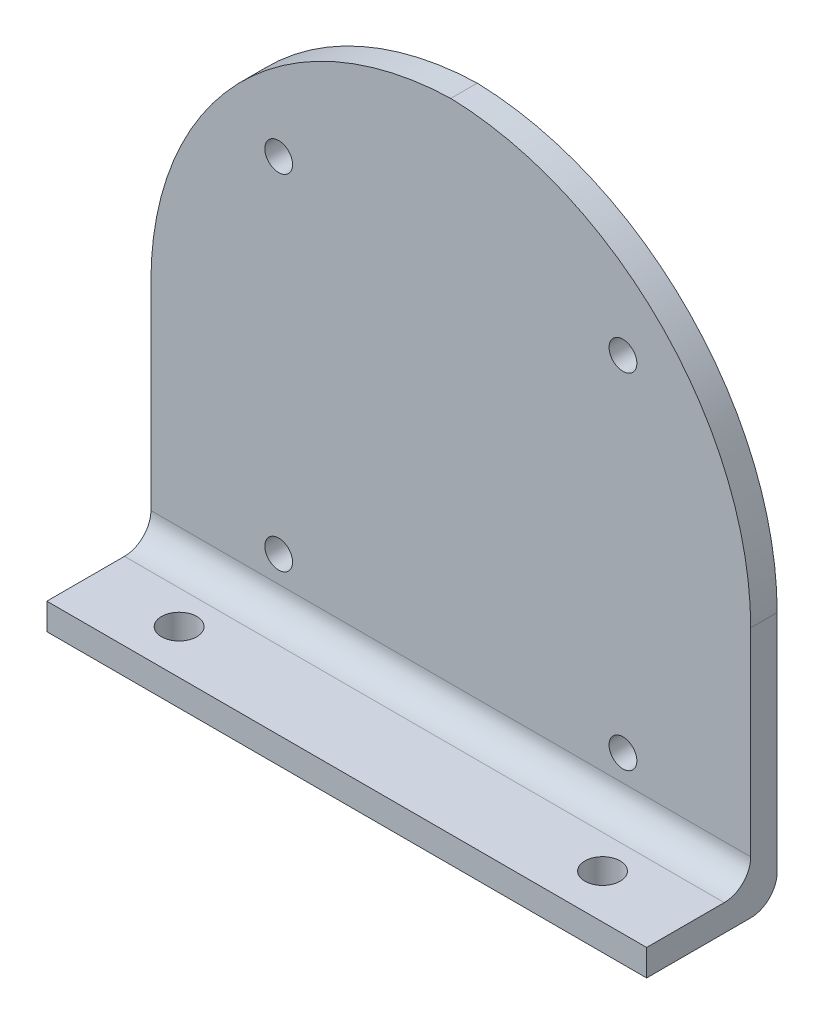
ISO-10303-21;
HEADER;
FILE_DESCRIPTION(('STEP AP214'),'2;1');
FILE_NAME('part.step','',(''),(''),'','','');
FILE_SCHEMA(('AUTOMOTIVE_DESIGN { 1 0 10303 214 1 1 1 1 }'));
ENDSEC;
DATA;
#1=APPLICATION_CONTEXT('core data for automotive mechanical design processes');
#2=APPLICATION_PROTOCOL_DEFINITION('international standard','automotive_design',2000,#1);
#3=PRODUCT_CONTEXT('',#1,'mechanical');
#4=PRODUCT('Part','Part','',(#3));
#5=PRODUCT_RELATED_PRODUCT_CATEGORY('part','',(#4));
#6=PRODUCT_DEFINITION_FORMATION('','',#4);
#7=PRODUCT_DEFINITION_CONTEXT('part definition',#1,'design');
#8=PRODUCT_DEFINITION('design','',#6,#7);
#9=PRODUCT_DEFINITION_SHAPE('','',#8);
#10=(LENGTH_UNIT() NAMED_UNIT(*) SI_UNIT(.MILLI.,.METRE.));
#11=(NAMED_UNIT(*) PLANE_ANGLE_UNIT() SI_UNIT($,.RADIAN.));
#12=(NAMED_UNIT(*) SI_UNIT($,.STERADIAN.) SOLID_ANGLE_UNIT());
#13=UNCERTAINTY_MEASURE_WITH_UNIT(LENGTH_MEASURE(1.E-05),#10,'distance_accuracy_value','');
#14=(GEOMETRIC_REPRESENTATION_CONTEXT(3) GLOBAL_UNCERTAINTY_ASSIGNED_CONTEXT((#13)) GLOBAL_UNIT_ASSIGNED_CONTEXT((#10,
#11,#12)) REPRESENTATION_CONTEXT('',''));
#15=CARTESIAN_POINT('',(0.,0.,0.));
#16=DIRECTION('',(0.,0.,1.));
#17=DIRECTION('',(1.,0.,0.));
#18=AXIS2_PLACEMENT_3D('',#15,#16,#17);
#19=CARTESIAN_POINT('',(0.,0.,3.));
#20=DIRECTION('',(0.,0.,-1.));
#21=DIRECTION('',(-1.,0.,0.));
#22=AXIS2_PLACEMENT_3D('',#19,#20,#21);
#23=PLANE('',#22);
#24=CARTESIAN_POINT('',(-19.5161471607487,24.5161471607487,3.));
#25=DIRECTION('',(0.,0.,1.));
#26=DIRECTION('',(1.,0.,0.));
#27=AXIS2_PLACEMENT_3D('',#24,#25,#26);
#28=CIRCLE('',#27,1.575);
#29=CARTESIAN_POINT('',(-17.9411471607487,24.5161471607487,3.));
#30=VERTEX_POINT('',#29);
#31=EDGE_CURVE('E147',#30,#30,#28,.T.);
#32=ORIENTED_EDGE('',*,*,#31,.F.);
#33=EDGE_LOOP('',(#32));
#34=FACE_BOUND('',#33,.T.);
#35=CARTESIAN_POINT('',(19.5161471607487,-14.5161471607487,3.));
#36=DIRECTION('',(0.,0.,1.));
#37=DIRECTION('',(1.,0.,0.));
#38=AXIS2_PLACEMENT_3D('',#35,#36,#37);
#39=CIRCLE('',#38,1.575);
#40=CARTESIAN_POINT('',(21.0911471607487,-14.5161471607487,3.));
#41=VERTEX_POINT('',#40);
#42=EDGE_CURVE('E142',#41,#41,#39,.T.);
#43=ORIENTED_EDGE('',*,*,#42,.F.);
#44=EDGE_LOOP('',(#43));
#45=FACE_BOUND('',#44,.T.);
#46=CARTESIAN_POINT('',(-19.5161471607487,-14.5161471607487,3.));
#47=DIRECTION('',(0.,0.,1.));
#48=DIRECTION('',(1.,0.,0.));
#49=AXIS2_PLACEMENT_3D('',#46,#47,#48);
#50=CIRCLE('',#49,1.575);
#51=CARTESIAN_POINT('',(-17.9411471607487,-14.5161471607487,3.));
#52=VERTEX_POINT('',#51);
#53=EDGE_CURVE('E154',#52,#52,#50,.T.);
#54=ORIENTED_EDGE('',*,*,#53,.F.);
#55=EDGE_LOOP('',(#54));
#56=FACE_BOUND('',#55,.T.);
#57=CARTESIAN_POINT('',(19.5161471607487,24.5161471607488,3.));
#58=DIRECTION('',(0.,0.,1.));
#59=DIRECTION('',(1.,0.,0.));
#60=AXIS2_PLACEMENT_3D('',#57,#58,#59);
#61=CIRCLE('',#60,1.575);
#62=CARTESIAN_POINT('',(21.0911471607487,24.5161471607488,3.));
#63=VERTEX_POINT('',#62);
#64=EDGE_CURVE('E148',#63,#63,#61,.T.);
#65=ORIENTED_EDGE('',*,*,#64,.F.);
#66=EDGE_LOOP('',(#65));
#67=FACE_BOUND('',#66,.T.);
#68=DIRECTION('',(0.,1.,0.));
#69=VECTOR('',#68,1.);
#70=CARTESIAN_POINT('',(34.,-40.,3.));
#71=LINE('',#70,#69);
#72=CARTESIAN_POINT('',(34.,-17.48,3.));
#73=VERTEX_POINT('',#72);
#74=CARTESIAN_POINT('',(34.,5.,3.));
#75=VERTEX_POINT('',#74);
#76=EDGE_CURVE('E168',#73,#75,#71,.T.);
#77=ORIENTED_EDGE('',*,*,#76,.T.);
#78=CARTESIAN_POINT('',(-1.00000000000001,5.,3.));
#79=DIRECTION('',(0.,0.,-1.));
#80=DIRECTION('',(-1.,0.,0.));
#81=AXIS2_PLACEMENT_3D('',#78,#79,#80);
#82=CIRCLE('',#81,35.);
#83=CARTESIAN_POINT('',(0.,39.9857113690718,3.));
#84=VERTEX_POINT('',#83);
#85=EDGE_CURVE('E44',#75,#84,#82,.F.);
#86=ORIENTED_EDGE('',*,*,#85,.T.);
#87=CARTESIAN_POINT('',(0.999999999999994,5.,3.));
#88=DIRECTION('',(0.,0.,-1.));
#89=DIRECTION('',(-1.,0.,0.));
#90=AXIS2_PLACEMENT_3D('',#87,#88,#89);
#91=CIRCLE('',#90,35.);
#92=CARTESIAN_POINT('',(-34.,5.,3.));
#93=VERTEX_POINT('',#92);
#94=EDGE_CURVE('E54',#84,#93,#91,.F.);
#95=ORIENTED_EDGE('',*,*,#94,.T.);
#96=DIRECTION('',(0.,-1.,0.));
#97=VECTOR('',#96,1.);
#98=CARTESIAN_POINT('',(-34.,-40.,3.));
#99=LINE('',#98,#97);
#100=CARTESIAN_POINT('',(-34.,-17.48,3.));
#101=VERTEX_POINT('',#100);
#102=EDGE_CURVE('E170',#93,#101,#99,.T.);
#103=ORIENTED_EDGE('',*,*,#102,.T.);
#104=DIRECTION('',(-1.,0.,0.));
#105=VECTOR('',#104,1.);
#106=CARTESIAN_POINT('',(34.,-17.48,3.));
#107=LINE('',#106,#105);
#108=EDGE_CURVE('E178',#101,#73,#107,.F.);
#109=ORIENTED_EDGE('',*,*,#108,.T.);
#110=EDGE_LOOP('',(#77,#86,#95,#103,#109));
#111=FACE_BOUND('',#110,.T.);
#112=ADVANCED_FACE('F35',(#34,#45,#56,#67,#111),#23,.F.);
#113=CARTESIAN_POINT('',(34.,-40.,3.));
#114=DIRECTION('',(-1.,0.,0.));
#115=DIRECTION('',(0.,0.,1.));
#116=AXIS2_PLACEMENT_3D('',#113,#114,#115);
#117=PLANE('',#116);
#118=DIRECTION('',(0.,1.,0.));
#119=VECTOR('',#118,1.);
#120=CARTESIAN_POINT('',(34.,-40.,0.));
#121=LINE('',#120,#119);
#122=CARTESIAN_POINT('',(34.,-20.48,0.));
#123=VERTEX_POINT('',#122);
#124=CARTESIAN_POINT('',(34.,5.,0.));
#125=VERTEX_POINT('',#124);
#126=EDGE_CURVE('E165',#123,#125,#121,.T.);
#127=ORIENTED_EDGE('',*,*,#126,.T.);
#128=DIRECTION('',(0.,0.,-1.));
#129=VECTOR('',#128,1.);
#130=CARTESIAN_POINT('',(34.,5.,3.));
#131=LINE('',#130,#129);
#132=EDGE_CURVE('E197',#125,#75,#131,.F.);
#133=ORIENTED_EDGE('',*,*,#132,.T.);
#134=ORIENTED_EDGE('',*,*,#76,.F.);
#135=CARTESIAN_POINT('',(34.,-17.48,6.));
#136=DIRECTION('',(-1.,0.,0.));
#137=DIRECTION('',(0.,0.,1.));
#138=AXIS2_PLACEMENT_3D('',#135,#136,#137);
#139=CIRCLE('',#138,3.);
#140=CARTESIAN_POINT('',(34.,-20.48,6.));
#141=VERTEX_POINT('',#140);
#142=EDGE_CURVE('E191',#73,#141,#139,.T.);
#143=ORIENTED_EDGE('',*,*,#142,.T.);
#144=DIRECTION('',(0.,0.,-1.));
#145=VECTOR('',#144,1.);
#146=CARTESIAN_POINT('',(34.,-20.48,14.8));
#147=LINE('',#146,#145);
#148=CARTESIAN_POINT('',(34.,-20.48,14.8));
#149=VERTEX_POINT('',#148);
#150=EDGE_CURVE('E114',#149,#141,#147,.T.);
#151=ORIENTED_EDGE('',*,*,#150,.F.);
#152=DIRECTION('',(0.,1.,0.));
#153=VECTOR('',#152,1.);
#154=CARTESIAN_POINT('',(34.,-23.48,14.8));
#155=LINE('',#154,#153);
#156=CARTESIAN_POINT('',(34.,-23.48,14.8));
#157=VERTEX_POINT('',#156);
#158=EDGE_CURVE('E117',#157,#149,#155,.T.);
#159=ORIENTED_EDGE('',*,*,#158,.F.);
#160=DIRECTION('',(0.,0.,1.));
#161=VECTOR('',#160,1.);
#162=CARTESIAN_POINT('',(34.,-23.48,0.));
#163=LINE('',#162,#161);
#164=CARTESIAN_POINT('',(34.,-23.48,3.));
#165=VERTEX_POINT('',#164);
#166=EDGE_CURVE('E103',#165,#157,#163,.T.);
#167=ORIENTED_EDGE('',*,*,#166,.F.);
#168=CARTESIAN_POINT('',(34.,-20.48,3.));
#169=DIRECTION('',(-1.,0.,0.));
#170=DIRECTION('',(0.,0.,1.));
#171=AXIS2_PLACEMENT_3D('',#168,#169,#170);
#172=CIRCLE('',#171,3.);
#173=EDGE_CURVE('E186',#165,#123,#172,.F.);
#174=ORIENTED_EDGE('',*,*,#173,.T.);
#175=EDGE_LOOP('',(#127,#133,#134,#143,#151,#159,#167,#174));
#176=FACE_BOUND('',#175,.T.);
#177=ADVANCED_FACE('F119',(#176),#117,.F.);
#178=CARTESIAN_POINT('',(-34.,-40.,3.));
#179=DIRECTION('',(1.,0.,0.));
#180=DIRECTION('',(0.,0.,-1.));
#181=AXIS2_PLACEMENT_3D('',#178,#179,#180);
#182=PLANE('',#181);
#183=ORIENTED_EDGE('',*,*,#102,.F.);
#184=DIRECTION('',(0.,0.,-1.));
#185=VECTOR('',#184,1.);
#186=CARTESIAN_POINT('',(-34.,5.,3.));
#187=LINE('',#186,#185);
#188=CARTESIAN_POINT('',(-34.,5.,0.));
#189=VERTEX_POINT('',#188);
#190=EDGE_CURVE('E11',#93,#189,#187,.T.);
#191=ORIENTED_EDGE('',*,*,#190,.T.);
#192=DIRECTION('',(0.,-1.,0.));
#193=VECTOR('',#192,1.);
#194=CARTESIAN_POINT('',(-34.,-40.,0.));
#195=LINE('',#194,#193);
#196=CARTESIAN_POINT('',(-34.,-20.48,0.));
#197=VERTEX_POINT('',#196);
#198=EDGE_CURVE('E171',#189,#197,#195,.T.);
#199=ORIENTED_EDGE('',*,*,#198,.T.);
#200=CARTESIAN_POINT('',(-34.,-20.48,3.));
#201=DIRECTION('',(1.,0.,0.));
#202=DIRECTION('',(0.,0.,-1.));
#203=AXIS2_PLACEMENT_3D('',#200,#201,#202);
#204=CIRCLE('',#203,3.);
#205=CARTESIAN_POINT('',(-34.,-23.48,3.));
#206=VERTEX_POINT('',#205);
#207=EDGE_CURVE('E183',#197,#206,#204,.F.);
#208=ORIENTED_EDGE('',*,*,#207,.T.);
#209=DIRECTION('',(0.,0.,1.));
#210=VECTOR('',#209,1.);
#211=CARTESIAN_POINT('',(-34.,-23.48,0.));
#212=LINE('',#211,#210);
#213=CARTESIAN_POINT('',(-34.,-23.48,14.8));
#214=VERTEX_POINT('',#213);
#215=EDGE_CURVE('E113',#206,#214,#212,.T.);
#216=ORIENTED_EDGE('',*,*,#215,.T.);
#217=DIRECTION('',(0.,-1.,0.));
#218=VECTOR('',#217,1.);
#219=CARTESIAN_POINT('',(-34.,-20.48,14.8));
#220=LINE('',#219,#218);
#221=CARTESIAN_POINT('',(-34.,-20.48,14.8));
#222=VERTEX_POINT('',#221);
#223=EDGE_CURVE('E128',#222,#214,#220,.T.);
#224=ORIENTED_EDGE('',*,*,#223,.F.);
#225=DIRECTION('',(0.,0.,-1.));
#226=VECTOR('',#225,1.);
#227=CARTESIAN_POINT('',(-34.,-20.48,14.8));
#228=LINE('',#227,#226);
#229=CARTESIAN_POINT('',(-34.,-20.48,6.));
#230=VERTEX_POINT('',#229);
#231=EDGE_CURVE('E138',#222,#230,#228,.T.);
#232=ORIENTED_EDGE('',*,*,#231,.T.);
#233=CARTESIAN_POINT('',(-34.,-17.48,6.));
#234=DIRECTION('',(1.,0.,0.));
#235=DIRECTION('',(0.,0.,-1.));
#236=AXIS2_PLACEMENT_3D('',#233,#234,#235);
#237=CIRCLE('',#236,3.);
#238=EDGE_CURVE('E188',#230,#101,#237,.T.);
#239=ORIENTED_EDGE('',*,*,#238,.T.);
#240=EDGE_LOOP('',(#183,#191,#199,#208,#216,#224,#232,#239));
#241=FACE_BOUND('',#240,.T.);
#242=ADVANCED_FACE('F215',(#241),#182,.F.);
#243=CARTESIAN_POINT('',(0.,0.,0.));
#244=DIRECTION('',(0.,0.,-1.));
#245=DIRECTION('',(-1.,0.,0.));
#246=AXIS2_PLACEMENT_3D('',#243,#244,#245);
#247=PLANE('',#246);
#248=CARTESIAN_POINT('',(0.999999999999994,5.,0.));
#249=DIRECTION('',(0.,0.,-1.));
#250=DIRECTION('',(-1.,0.,0.));
#251=AXIS2_PLACEMENT_3D('',#248,#249,#250);
#252=CIRCLE('',#251,35.);
#253=CARTESIAN_POINT('',(0.,39.9857113690718,0.));
#254=VERTEX_POINT('',#253);
#255=EDGE_CURVE('E193',#189,#254,#252,.T.);
#256=ORIENTED_EDGE('',*,*,#255,.T.);
#257=CARTESIAN_POINT('',(-1.00000000000001,5.,0.));
#258=DIRECTION('',(0.,0.,-1.));
#259=DIRECTION('',(-1.,0.,0.));
#260=AXIS2_PLACEMENT_3D('',#257,#258,#259);
#261=CIRCLE('',#260,35.);
#262=EDGE_CURVE('E195',#254,#125,#261,.T.);
#263=ORIENTED_EDGE('',*,*,#262,.T.);
#264=ORIENTED_EDGE('',*,*,#126,.F.);
#265=DIRECTION('',(-1.,0.,0.));
#266=VECTOR('',#265,1.);
#267=CARTESIAN_POINT('',(-34.,-20.48,0.));
#268=LINE('',#267,#266);
#269=EDGE_CURVE('E180',#123,#197,#268,.T.);
#270=ORIENTED_EDGE('',*,*,#269,.T.);
#271=ORIENTED_EDGE('',*,*,#198,.F.);
#272=EDGE_LOOP('',(#256,#263,#264,#270,#271));
#273=FACE_BOUND('',#272,.T.);
#274=CARTESIAN_POINT('',(19.5161471607487,24.5161471607488,0.));
#275=DIRECTION('',(0.,0.,1.));
#276=DIRECTION('',(1.,0.,0.));
#277=AXIS2_PLACEMENT_3D('',#274,#275,#276);
#278=CIRCLE('',#277,1.575);
#279=CARTESIAN_POINT('',(21.0911471607487,24.5161471607488,0.));
#280=VERTEX_POINT('',#279);
#281=EDGE_CURVE('E144',#280,#280,#278,.T.);
#282=ORIENTED_EDGE('',*,*,#281,.T.);
#283=EDGE_LOOP('',(#282));
#284=FACE_BOUND('',#283,.T.);
#285=CARTESIAN_POINT('',(-19.5161471607487,-14.5161471607487,0.));
#286=DIRECTION('',(0.,0.,1.));
#287=DIRECTION('',(1.,0.,0.));
#288=AXIS2_PLACEMENT_3D('',#285,#286,#287);
#289=CIRCLE('',#288,1.575);
#290=CARTESIAN_POINT('',(-17.9411471607487,-14.5161471607487,0.));
#291=VERTEX_POINT('',#290);
#292=EDGE_CURVE('E151',#291,#291,#289,.T.);
#293=ORIENTED_EDGE('',*,*,#292,.T.);
#294=EDGE_LOOP('',(#293));
#295=FACE_BOUND('',#294,.T.);
#296=CARTESIAN_POINT('',(19.5161471607487,-14.5161471607487,0.));
#297=DIRECTION('',(0.,0.,1.));
#298=DIRECTION('',(1.,0.,0.));
#299=AXIS2_PLACEMENT_3D('',#296,#297,#298);
#300=CIRCLE('',#299,1.575);
#301=CARTESIAN_POINT('',(21.0911471607487,-14.5161471607487,0.));
#302=VERTEX_POINT('',#301);
#303=EDGE_CURVE('E157',#302,#302,#300,.T.);
#304=ORIENTED_EDGE('',*,*,#303,.T.);
#305=EDGE_LOOP('',(#304));
#306=FACE_BOUND('',#305,.T.);
#307=CARTESIAN_POINT('',(-19.5161471607487,24.5161471607487,0.));
#308=DIRECTION('',(0.,0.,1.));
#309=DIRECTION('',(1.,0.,0.));
#310=AXIS2_PLACEMENT_3D('',#307,#308,#309);
#311=CIRCLE('',#310,1.575);
#312=CARTESIAN_POINT('',(-17.9411471607487,24.5161471607487,0.));
#313=VERTEX_POINT('',#312);
#314=EDGE_CURVE('E162',#313,#313,#311,.T.);
#315=ORIENTED_EDGE('',*,*,#314,.T.);
#316=EDGE_LOOP('',(#315));
#317=FACE_BOUND('',#316,.T.);
#318=ADVANCED_FACE('F221',(#273,#284,#295,#306,#317),#247,.T.);
#319=CARTESIAN_POINT('',(-19.5161471607487,24.5161471607487,0.));
#320=DIRECTION('',(0.,0.,1.));
#321=DIRECTION('',(1.,0.,0.));
#322=AXIS2_PLACEMENT_3D('',#319,#320,#321);
#323=CYLINDRICAL_SURFACE('',#322,1.575);
#324=ORIENTED_EDGE('',*,*,#314,.F.);
#325=EDGE_LOOP('',(#324));
#326=FACE_BOUND('',#325,.T.);
#327=ORIENTED_EDGE('',*,*,#31,.T.);
#328=EDGE_LOOP('',(#327));
#329=FACE_BOUND('',#328,.T.);
#330=ADVANCED_FACE('F267',(#326,#329),#323,.F.);
#331=CARTESIAN_POINT('',(19.5161471607487,-14.5161471607487,0.));
#332=DIRECTION('',(0.,0.,1.));
#333=DIRECTION('',(1.,0.,0.));
#334=AXIS2_PLACEMENT_3D('',#331,#332,#333);
#335=CYLINDRICAL_SURFACE('',#334,1.575);
#336=ORIENTED_EDGE('',*,*,#303,.F.);
#337=EDGE_LOOP('',(#336));
#338=FACE_BOUND('',#337,.T.);
#339=ORIENTED_EDGE('',*,*,#42,.T.);
#340=EDGE_LOOP('',(#339));
#341=FACE_BOUND('',#340,.T.);
#342=ADVANCED_FACE('F330',(#338,#341),#335,.F.);
#343=CARTESIAN_POINT('',(-19.5161471607487,-14.5161471607487,0.));
#344=DIRECTION('',(0.,0.,1.));
#345=DIRECTION('',(1.,0.,0.));
#346=AXIS2_PLACEMENT_3D('',#343,#344,#345);
#347=CYLINDRICAL_SURFACE('',#346,1.575);
#348=ORIENTED_EDGE('',*,*,#292,.F.);
#349=EDGE_LOOP('',(#348));
#350=FACE_BOUND('',#349,.T.);
#351=ORIENTED_EDGE('',*,*,#53,.T.);
#352=EDGE_LOOP('',(#351));
#353=FACE_BOUND('',#352,.T.);
#354=ADVANCED_FACE('F318',(#350,#353),#347,.F.);
#355=CARTESIAN_POINT('',(19.5161471607487,24.5161471607488,0.));
#356=DIRECTION('',(0.,0.,1.));
#357=DIRECTION('',(1.,0.,0.));
#358=AXIS2_PLACEMENT_3D('',#355,#356,#357);
#359=CYLINDRICAL_SURFACE('',#358,1.575);
#360=ORIENTED_EDGE('',*,*,#281,.F.);
#361=EDGE_LOOP('',(#360));
#362=FACE_BOUND('',#361,.T.);
#363=ORIENTED_EDGE('',*,*,#64,.T.);
#364=EDGE_LOOP('',(#363));
#365=FACE_BOUND('',#364,.T.);
#366=ADVANCED_FACE('F251',(#362,#365),#359,.F.);
#367=CARTESIAN_POINT('',(-34.,-23.48,0.));
#368=DIRECTION('',(0.,1.,0.));
#369=DIRECTION('',(0.,0.,1.));
#370=AXIS2_PLACEMENT_3D('',#367,#368,#369);
#371=PLANE('',#370);
#372=CARTESIAN_POINT('',(-24.,-23.48,9.8));
#373=DIRECTION('',(0.,1.,0.));
#374=DIRECTION('',(0.,0.,1.));
#375=AXIS2_PLACEMENT_3D('',#372,#373,#374);
#376=CIRCLE('',#375,2.);
#377=CARTESIAN_POINT('',(-24.,-23.48,11.8));
#378=VERTEX_POINT('',#377);
#379=EDGE_CURVE('E231',#378,#378,#376,.T.);
#380=ORIENTED_EDGE('',*,*,#379,.T.);
#381=EDGE_LOOP('',(#380));
#382=FACE_BOUND('',#381,.T.);
#383=CARTESIAN_POINT('',(24.,-23.48,9.8));
#384=DIRECTION('',(0.,1.,0.));
#385=DIRECTION('',(0.,0.,1.));
#386=AXIS2_PLACEMENT_3D('',#383,#384,#385);
#387=CIRCLE('',#386,2.);
#388=CARTESIAN_POINT('',(24.,-23.48,11.8));
#389=VERTEX_POINT('',#388);
#390=EDGE_CURVE('E129',#389,#389,#387,.T.);
#391=ORIENTED_EDGE('',*,*,#390,.T.);
#392=EDGE_LOOP('',(#391));
#393=FACE_BOUND('',#392,.T.);
#394=ORIENTED_EDGE('',*,*,#215,.F.);
#395=DIRECTION('',(-1.,0.,0.));
#396=VECTOR('',#395,1.);
#397=CARTESIAN_POINT('',(34.,-23.48,3.));
#398=LINE('',#397,#396);
#399=EDGE_CURVE('E110',#206,#165,#398,.F.);
#400=ORIENTED_EDGE('',*,*,#399,.T.);
#401=ORIENTED_EDGE('',*,*,#166,.T.);
#402=DIRECTION('',(1.,0.,0.));
#403=VECTOR('',#402,1.);
#404=CARTESIAN_POINT('',(34.,-23.48,14.8));
#405=LINE('',#404,#403);
#406=EDGE_CURVE('E108',#214,#157,#405,.T.);
#407=ORIENTED_EDGE('',*,*,#406,.F.);
#408=EDGE_LOOP('',(#394,#400,#401,#407));
#409=FACE_BOUND('',#408,.T.);
#410=ADVANCED_FACE('F106',(#382,#393,#409),#371,.F.);
#411=CARTESIAN_POINT('',(-34.,-20.48,14.8));
#412=DIRECTION('',(0.,-1.,0.));
#413=DIRECTION('',(0.,0.,-1.));
#414=AXIS2_PLACEMENT_3D('',#411,#412,#413);
#415=PLANE('',#414);
#416=CARTESIAN_POINT('',(-24.,-20.48,9.8));
#417=DIRECTION('',(0.,1.,0.));
#418=DIRECTION('',(0.,0.,1.));
#419=AXIS2_PLACEMENT_3D('',#416,#417,#418);
#420=CIRCLE('',#419,2.);
#421=CARTESIAN_POINT('',(-24.,-20.48,11.8));
#422=VERTEX_POINT('',#421);
#423=EDGE_CURVE('E229',#422,#422,#420,.T.);
#424=ORIENTED_EDGE('',*,*,#423,.F.);
#425=EDGE_LOOP('',(#424));
#426=FACE_BOUND('',#425,.T.);
#427=CARTESIAN_POINT('',(24.,-20.48,9.8));
#428=DIRECTION('',(0.,1.,0.));
#429=DIRECTION('',(0.,0.,1.));
#430=AXIS2_PLACEMENT_3D('',#427,#428,#429);
#431=CIRCLE('',#430,2.);
#432=CARTESIAN_POINT('',(24.,-20.48,11.8));
#433=VERTEX_POINT('',#432);
#434=EDGE_CURVE('E132',#433,#433,#431,.T.);
#435=ORIENTED_EDGE('',*,*,#434,.F.);
#436=EDGE_LOOP('',(#435));
#437=FACE_BOUND('',#436,.T.);
#438=ORIENTED_EDGE('',*,*,#150,.T.);
#439=DIRECTION('',(-1.,0.,0.));
#440=VECTOR('',#439,1.);
#441=CARTESIAN_POINT('',(-34.,-20.48,6.));
#442=LINE('',#441,#440);
#443=EDGE_CURVE('E173',#141,#230,#442,.T.);
#444=ORIENTED_EDGE('',*,*,#443,.T.);
#445=ORIENTED_EDGE('',*,*,#231,.F.);
#446=DIRECTION('',(-1.,0.,0.));
#447=VECTOR('',#446,1.);
#448=CARTESIAN_POINT('',(-34.,-20.48,14.8));
#449=LINE('',#448,#447);
#450=EDGE_CURVE('E123',#149,#222,#449,.T.);
#451=ORIENTED_EDGE('',*,*,#450,.F.);
#452=EDGE_LOOP('',(#438,#444,#445,#451));
#453=FACE_BOUND('',#452,.T.);
#454=ADVANCED_FACE('F212',(#426,#437,#453),#415,.F.);
#455=CARTESIAN_POINT('',(0.,0.,14.8));
#456=DIRECTION('',(0.,0.,1.));
#457=DIRECTION('',(1.,0.,0.));
#458=AXIS2_PLACEMENT_3D('',#455,#456,#457);
#459=PLANE('',#458);
#460=ORIENTED_EDGE('',*,*,#406,.T.);
#461=ORIENTED_EDGE('',*,*,#158,.T.);
#462=ORIENTED_EDGE('',*,*,#450,.T.);
#463=ORIENTED_EDGE('',*,*,#223,.T.);
#464=EDGE_LOOP('',(#460,#461,#462,#463));
#465=FACE_BOUND('',#464,.T.);
#466=ADVANCED_FACE('F126',(#465),#459,.T.);
#467=CARTESIAN_POINT('',(-34.,-17.48,6.));
#468=DIRECTION('',(1.,0.,0.));
#469=DIRECTION('',(0.,0.,-1.));
#470=AXIS2_PLACEMENT_3D('',#467,#468,#469);
#471=CYLINDRICAL_SURFACE('',#470,3.);
#472=ORIENTED_EDGE('',*,*,#142,.F.);
#473=ORIENTED_EDGE('',*,*,#108,.F.);
#474=ORIENTED_EDGE('',*,*,#238,.F.);
#475=ORIENTED_EDGE('',*,*,#443,.F.);
#476=EDGE_LOOP('',(#472,#473,#474,#475));
#477=FACE_BOUND('',#476,.T.);
#478=ADVANCED_FACE('F209',(#477),#471,.F.);
#479=CARTESIAN_POINT('',(0.,-20.48,3.));
#480=DIRECTION('',(1.,0.,0.));
#481=DIRECTION('',(0.,0.,-1.));
#482=AXIS2_PLACEMENT_3D('',#479,#480,#481);
#483=CYLINDRICAL_SURFACE('',#482,3.);
#484=ORIENTED_EDGE('',*,*,#173,.F.);
#485=ORIENTED_EDGE('',*,*,#399,.F.);
#486=ORIENTED_EDGE('',*,*,#207,.F.);
#487=ORIENTED_EDGE('',*,*,#269,.F.);
#488=EDGE_LOOP('',(#484,#485,#486,#487));
#489=FACE_BOUND('',#488,.T.);
#490=ADVANCED_FACE('F218',(#489),#483,.T.);
#491=CARTESIAN_POINT('',(24.,-34.98,9.8));
#492=DIRECTION('',(0.,1.,0.));
#493=DIRECTION('',(0.,0.,1.));
#494=AXIS2_PLACEMENT_3D('',#491,#492,#493);
#495=CYLINDRICAL_SURFACE('',#494,2.);
#496=CARTESIAN_POINT('',(24.,-20.48,11.8));
#497=CARTESIAN_POINT('',(24.,-20.51125,11.8));
#498=CARTESIAN_POINT('',(24.,-20.5425,11.8));
#499=CARTESIAN_POINT('',(24.,-20.605,11.8));
#500=CARTESIAN_POINT('',(24.,-20.63625,11.8));
#501=CARTESIAN_POINT('',(24.,-20.69875,11.8));
#502=CARTESIAN_POINT('',(24.,-20.73,11.8));
#503=CARTESIAN_POINT('',(24.,-20.7925,11.8));
#504=CARTESIAN_POINT('',(24.,-20.82375,11.8));
#505=CARTESIAN_POINT('',(24.,-20.88625,11.8));
#506=CARTESIAN_POINT('',(24.,-20.9175,11.8));
#507=CARTESIAN_POINT('',(24.,-20.98,11.8));
#508=CARTESIAN_POINT('',(24.,-21.01125,11.8));
#509=CARTESIAN_POINT('',(24.,-21.07375,11.8));
#510=CARTESIAN_POINT('',(24.,-21.105,11.8));
#511=CARTESIAN_POINT('',(24.,-21.1675,11.8));
#512=CARTESIAN_POINT('',(24.,-21.19875,11.8));
#513=CARTESIAN_POINT('',(24.,-21.26125,11.8));
#514=CARTESIAN_POINT('',(24.,-21.2925,11.8));
#515=CARTESIAN_POINT('',(24.,-21.355,11.8));
#516=CARTESIAN_POINT('',(24.,-21.38625,11.8));
#517=CARTESIAN_POINT('',(24.,-21.44875,11.8));
#518=CARTESIAN_POINT('',(24.,-21.48,11.8));
#519=CARTESIAN_POINT('',(24.,-21.5425,11.8));
#520=CARTESIAN_POINT('',(24.,-21.57375,11.8));
#521=CARTESIAN_POINT('',(24.,-21.63625,11.8));
#522=CARTESIAN_POINT('',(24.,-21.6675,11.8));
#523=CARTESIAN_POINT('',(24.,-21.73,11.8));
#524=CARTESIAN_POINT('',(24.,-21.76125,11.8));
#525=CARTESIAN_POINT('',(24.,-21.82375,11.8));
#526=CARTESIAN_POINT('',(24.,-21.855,11.8));
#527=CARTESIAN_POINT('',(24.,-21.9175,11.8));
#528=CARTESIAN_POINT('',(24.,-21.94875,11.8));
#529=CARTESIAN_POINT('',(24.,-22.01125,11.8));
#530=CARTESIAN_POINT('',(24.,-22.0425,11.8));
#531=CARTESIAN_POINT('',(24.,-22.105,11.8));
#532=CARTESIAN_POINT('',(24.,-22.13625,11.8));
#533=CARTESIAN_POINT('',(24.,-22.19875,11.8));
#534=CARTESIAN_POINT('',(24.,-22.23,11.8));
#535=CARTESIAN_POINT('',(24.,-22.2925,11.8));
#536=CARTESIAN_POINT('',(24.,-22.32375,11.8));
#537=CARTESIAN_POINT('',(24.,-22.38625,11.8));
#538=CARTESIAN_POINT('',(24.,-22.4175,11.8));
#539=CARTESIAN_POINT('',(24.,-22.48,11.8));
#540=CARTESIAN_POINT('',(24.,-22.51125,11.8));
#541=CARTESIAN_POINT('',(24.,-22.57375,11.8));
#542=CARTESIAN_POINT('',(24.,-22.605,11.8));
#543=CARTESIAN_POINT('',(24.,-22.6675,11.8));
#544=CARTESIAN_POINT('',(24.,-22.69875,11.8));
#545=CARTESIAN_POINT('',(24.,-22.76125,11.8));
#546=CARTESIAN_POINT('',(24.,-22.7925,11.8));
#547=CARTESIAN_POINT('',(24.,-22.855,11.8));
#548=CARTESIAN_POINT('',(24.,-22.88625,11.8));
#549=CARTESIAN_POINT('',(24.,-22.94875,11.8));
#550=CARTESIAN_POINT('',(24.,-22.98,11.8));
#551=CARTESIAN_POINT('',(24.,-23.0425,11.8));
#552=CARTESIAN_POINT('',(24.,-23.07375,11.8));
#553=CARTESIAN_POINT('',(24.,-23.13625,11.8));
#554=CARTESIAN_POINT('',(24.,-23.1675,11.8));
#555=CARTESIAN_POINT('',(24.,-23.23,11.8));
#556=CARTESIAN_POINT('',(24.,-23.26125,11.8));
#557=CARTESIAN_POINT('',(24.,-23.32375,11.8));
#558=CARTESIAN_POINT('',(24.,-23.355,11.8));
#559=CARTESIAN_POINT('',(24.,-23.4175,11.8));
#560=CARTESIAN_POINT('',(24.,-23.44875,11.8));
#561=CARTESIAN_POINT('',(24.,-23.48,11.8));
#562=B_SPLINE_CURVE_WITH_KNOTS('',3,(#496,#497,#498,#499,#500,#501,#502,#503,#504,#505,#506,
#507,#508,#509,#510,#511,#512,#513,#514,#515,#516,#517,#518,#519,#520,#521,#522,#523,#524,#525,
#526,#527,#528,#529,#530,#531,#532,#533,#534,#535,#536,#537,#538,#539,#540,#541,#542,#543,#544,
#545,#546,#547,#548,#549,#550,#551,#552,#553,#554,#555,#556,#557,#558,#559,#560,#561),
.UNSPECIFIED.,.F.,.F.,(4,2,2,2,2,2,2,2,2,2,2,2,2,2,2,2,2,2,2,2,2,2,2,2,2,2,2,2,2,2,2,2,4),(0.,
0.0937499999999966,0.1875,0.281249999999997,0.375,0.468749999999997,0.5625,0.656249999999997,
0.750000000000001,0.843749999999997,0.937499999999997,1.03125,1.125,1.21875,1.3125,1.40625,1.5,
1.59375,1.6875,1.78125,1.875,1.96875,2.06249999999999,2.15625,2.25,2.34375,2.4375,2.53125,2.625,
2.71875,2.8125,2.90625,3.),.UNSPECIFIED.);
#563=EDGE_CURVE('BSEAM240',#433,#389,#562,.T.);
#564=ORIENTED_EDGE('',*,*,#434,.T.);
#565=ORIENTED_EDGE('',*,*,#390,.F.);
#566=ORIENTED_EDGE('',*,*,#563,.T.);
#567=ORIENTED_EDGE('',*,*,#563,.F.);
#568=EDGE_LOOP('',(#564,#566,#565,#567));
#569=FACE_BOUND('',#568,.T.);
#570=ADVANCED_FACE('F240',(#569),#495,.F.);
#571=CARTESIAN_POINT('',(-24.,-34.98,9.8));
#572=DIRECTION('',(0.,1.,0.));
#573=DIRECTION('',(0.,0.,1.));
#574=AXIS2_PLACEMENT_3D('',#571,#572,#573);
#575=CYLINDRICAL_SURFACE('',#574,2.);
#576=CARTESIAN_POINT('',(-24.,-20.48,11.8));
#577=CARTESIAN_POINT('',(-24.,-20.51125,11.8));
#578=CARTESIAN_POINT('',(-24.,-20.5425,11.8));
#579=CARTESIAN_POINT('',(-24.,-20.605,11.8));
#580=CARTESIAN_POINT('',(-24.,-20.63625,11.8));
#581=CARTESIAN_POINT('',(-24.,-20.69875,11.8));
#582=CARTESIAN_POINT('',(-24.,-20.73,11.8));
#583=CARTESIAN_POINT('',(-24.,-20.7925,11.8));
#584=CARTESIAN_POINT('',(-24.,-20.82375,11.8));
#585=CARTESIAN_POINT('',(-24.,-20.88625,11.8));
#586=CARTESIAN_POINT('',(-24.,-20.9175,11.8));
#587=CARTESIAN_POINT('',(-24.,-20.98,11.8));
#588=CARTESIAN_POINT('',(-24.,-21.01125,11.8));
#589=CARTESIAN_POINT('',(-24.,-21.07375,11.8));
#590=CARTESIAN_POINT('',(-24.,-21.105,11.8));
#591=CARTESIAN_POINT('',(-24.,-21.1675,11.8));
#592=CARTESIAN_POINT('',(-24.,-21.19875,11.8));
#593=CARTESIAN_POINT('',(-24.,-21.26125,11.8));
#594=CARTESIAN_POINT('',(-24.,-21.2925,11.8));
#595=CARTESIAN_POINT('',(-24.,-21.355,11.8));
#596=CARTESIAN_POINT('',(-24.,-21.38625,11.8));
#597=CARTESIAN_POINT('',(-24.,-21.44875,11.8));
#598=CARTESIAN_POINT('',(-24.,-21.48,11.8));
#599=CARTESIAN_POINT('',(-24.,-21.5425,11.8));
#600=CARTESIAN_POINT('',(-24.,-21.57375,11.8));
#601=CARTESIAN_POINT('',(-24.,-21.63625,11.8));
#602=CARTESIAN_POINT('',(-24.,-21.6675,11.8));
#603=CARTESIAN_POINT('',(-24.,-21.73,11.8));
#604=CARTESIAN_POINT('',(-24.,-21.76125,11.8));
#605=CARTESIAN_POINT('',(-24.,-21.82375,11.8));
#606=CARTESIAN_POINT('',(-24.,-21.855,11.8));
#607=CARTESIAN_POINT('',(-24.,-21.9175,11.8));
#608=CARTESIAN_POINT('',(-24.,-21.94875,11.8));
#609=CARTESIAN_POINT('',(-24.,-22.01125,11.8));
#610=CARTESIAN_POINT('',(-24.,-22.0425,11.8));
#611=CARTESIAN_POINT('',(-24.,-22.105,11.8));
#612=CARTESIAN_POINT('',(-24.,-22.13625,11.8));
#613=CARTESIAN_POINT('',(-24.,-22.19875,11.8));
#614=CARTESIAN_POINT('',(-24.,-22.23,11.8));
#615=CARTESIAN_POINT('',(-24.,-22.2925,11.8));
#616=CARTESIAN_POINT('',(-24.,-22.32375,11.8));
#617=CARTESIAN_POINT('',(-24.,-22.38625,11.8));
#618=CARTESIAN_POINT('',(-24.,-22.4175,11.8));
#619=CARTESIAN_POINT('',(-24.,-22.48,11.8));
#620=CARTESIAN_POINT('',(-24.,-22.51125,11.8));
#621=CARTESIAN_POINT('',(-24.,-22.57375,11.8));
#622=CARTESIAN_POINT('',(-24.,-22.605,11.8));
#623=CARTESIAN_POINT('',(-24.,-22.6675,11.8));
#624=CARTESIAN_POINT('',(-24.,-22.69875,11.8));
#625=CARTESIAN_POINT('',(-24.,-22.76125,11.8));
#626=CARTESIAN_POINT('',(-24.,-22.7925,11.8));
#627=CARTESIAN_POINT('',(-24.,-22.855,11.8));
#628=CARTESIAN_POINT('',(-24.,-22.88625,11.8));
#629=CARTESIAN_POINT('',(-24.,-22.94875,11.8));
#630=CARTESIAN_POINT('',(-24.,-22.98,11.8));
#631=CARTESIAN_POINT('',(-24.,-23.0425,11.8));
#632=CARTESIAN_POINT('',(-24.,-23.07375,11.8));
#633=CARTESIAN_POINT('',(-24.,-23.13625,11.8));
#634=CARTESIAN_POINT('',(-24.,-23.1675,11.8));
#635=CARTESIAN_POINT('',(-24.,-23.23,11.8));
#636=CARTESIAN_POINT('',(-24.,-23.26125,11.8));
#637=CARTESIAN_POINT('',(-24.,-23.32375,11.8));
#638=CARTESIAN_POINT('',(-24.,-23.355,11.8));
#639=CARTESIAN_POINT('',(-24.,-23.4175,11.8));
#640=CARTESIAN_POINT('',(-24.,-23.44875,11.8));
#641=CARTESIAN_POINT('',(-24.,-23.48,11.8));
#642=B_SPLINE_CURVE_WITH_KNOTS('',3,(#576,#577,#578,#579,#580,#581,#582,#583,#584,#585,#586,
#587,#588,#589,#590,#591,#592,#593,#594,#595,#596,#597,#598,#599,#600,#601,#602,#603,#604,#605,
#606,#607,#608,#609,#610,#611,#612,#613,#614,#615,#616,#617,#618,#619,#620,#621,#622,#623,#624,
#625,#626,#627,#628,#629,#630,#631,#632,#633,#634,#635,#636,#637,#638,#639,#640,#641),
.UNSPECIFIED.,.F.,.F.,(4,2,2,2,2,2,2,2,2,2,2,2,2,2,2,2,2,2,2,2,2,2,2,2,2,2,2,2,2,2,2,2,4),(0.,
0.0937499999999966,0.1875,0.281249999999997,0.375,0.468749999999997,0.5625,0.656249999999997,
0.750000000000001,0.843749999999997,0.937499999999997,1.03125,1.125,1.21875,1.3125,1.40625,1.5,
1.59375,1.6875,1.78125,1.875,1.96875,2.06249999999999,2.15625,2.25,2.34375,2.4375,2.53125,2.625,
2.71875,2.8125,2.90625,3.),.UNSPECIFIED.);
#643=EDGE_CURVE('BSEAM280',#422,#378,#642,.T.);
#644=ORIENTED_EDGE('',*,*,#423,.T.);
#645=ORIENTED_EDGE('',*,*,#379,.F.);
#646=ORIENTED_EDGE('',*,*,#643,.T.);
#647=ORIENTED_EDGE('',*,*,#643,.F.);
#648=EDGE_LOOP('',(#644,#646,#645,#647));
#649=FACE_BOUND('',#648,.T.);
#650=ADVANCED_FACE('F280',(#649),#575,.F.);
#651=CARTESIAN_POINT('',(0.999999999999994,5.,3.));
#652=DIRECTION('',(0.,0.,-1.));
#653=DIRECTION('',(-1.,0.,0.));
#654=AXIS2_PLACEMENT_3D('',#651,#652,#653);
#655=CYLINDRICAL_SURFACE('',#654,35.);
#656=ORIENTED_EDGE('',*,*,#190,.F.);
#657=ORIENTED_EDGE('',*,*,#94,.F.);
#658=DIRECTION('',(0.,0.,-1.));
#659=VECTOR('',#658,1.);
#660=CARTESIAN_POINT('',(0.,39.9857113690718,1.5));
#661=LINE('',#660,#659);
#662=EDGE_CURVE('E39',#254,#84,#661,.F.);
#663=ORIENTED_EDGE('',*,*,#662,.F.);
#664=ORIENTED_EDGE('',*,*,#255,.F.);
#665=EDGE_LOOP('',(#656,#657,#663,#664));
#666=FACE_BOUND('',#665,.T.);
#667=ADVANCED_FACE('F37',(#666),#655,.T.);
#668=CARTESIAN_POINT('',(-1.00000000000001,5.,3.));
#669=DIRECTION('',(0.,0.,-1.));
#670=DIRECTION('',(-1.,0.,0.));
#671=AXIS2_PLACEMENT_3D('',#668,#669,#670);
#672=CYLINDRICAL_SURFACE('',#671,35.);
#673=ORIENTED_EDGE('',*,*,#85,.F.);
#674=ORIENTED_EDGE('',*,*,#132,.F.);
#675=ORIENTED_EDGE('',*,*,#262,.F.);
#676=ORIENTED_EDGE('',*,*,#662,.T.);
#677=EDGE_LOOP('',(#673,#674,#675,#676));
#678=FACE_BOUND('',#677,.T.);
#679=ADVANCED_FACE('F227',(#678),#672,.T.);
#680=CLOSED_SHELL('',(#112,#177,#242,#318,#330,#342,#354,#366,#410,#454,#466,#478,#490,#570,
#650,#667,#679));
#681=MANIFOLD_SOLID_BREP('B2',#680);
#682=ADVANCED_BREP_SHAPE_REPRESENTATION('',(#18,#681),#14);
#683=SHAPE_DEFINITION_REPRESENTATION(#9,#682);
ENDSEC;
END-ISO-10303-21;
